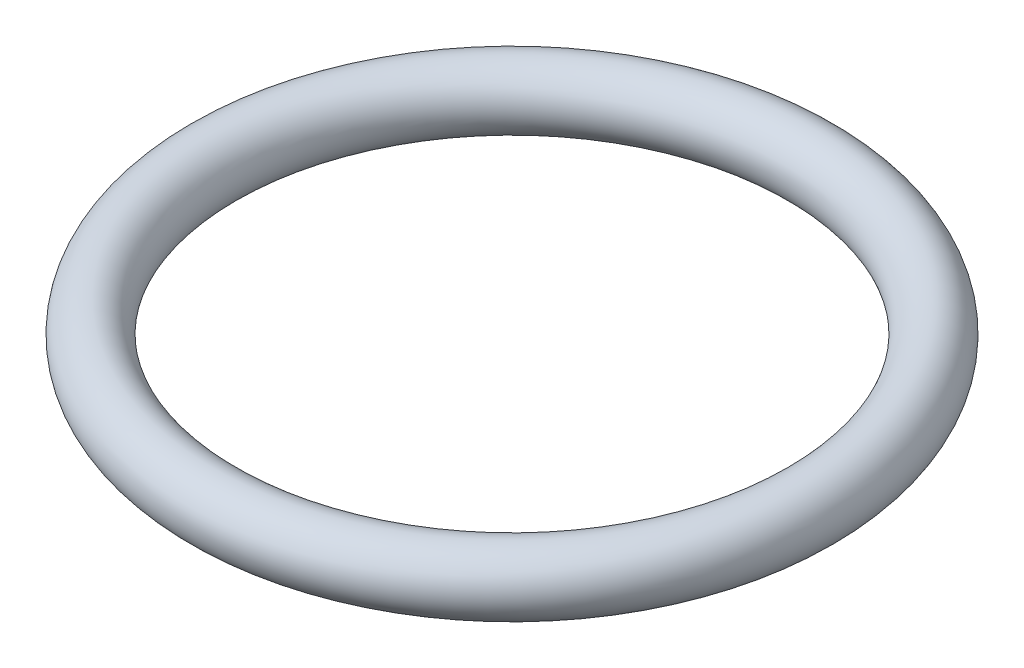
ISO-10303-21;
HEADER;
FILE_DESCRIPTION(('STEP AP214'),'2;1');
FILE_NAME('part.step','',(''),(''),'','','');
FILE_SCHEMA(('AUTOMOTIVE_DESIGN { 1 0 10303 214 1 1 1 1 }'));
ENDSEC;
DATA;
#1=APPLICATION_CONTEXT('core data for automotive mechanical design processes');
#2=APPLICATION_PROTOCOL_DEFINITION('international standard','automotive_design',2000,#1);
#3=PRODUCT_CONTEXT('',#1,'mechanical');
#4=PRODUCT('Part','Part','',(#3));
#5=PRODUCT_RELATED_PRODUCT_CATEGORY('part','',(#4));
#6=PRODUCT_DEFINITION_FORMATION('','',#4);
#7=PRODUCT_DEFINITION_CONTEXT('part definition',#1,'design');
#8=PRODUCT_DEFINITION('design','',#6,#7);
#9=PRODUCT_DEFINITION_SHAPE('','',#8);
#10=(LENGTH_UNIT() NAMED_UNIT(*) SI_UNIT(.MILLI.,.METRE.));
#11=(NAMED_UNIT(*) PLANE_ANGLE_UNIT() SI_UNIT($,.RADIAN.));
#12=(NAMED_UNIT(*) SI_UNIT($,.STERADIAN.) SOLID_ANGLE_UNIT());
#13=UNCERTAINTY_MEASURE_WITH_UNIT(LENGTH_MEASURE(1.E-05),#10,'distance_accuracy_value','');
#14=(GEOMETRIC_REPRESENTATION_CONTEXT(3) GLOBAL_UNCERTAINTY_ASSIGNED_CONTEXT((#13)) GLOBAL_UNIT_ASSIGNED_CONTEXT((#10,
#11,#12)) REPRESENTATION_CONTEXT('',''));
#15=CARTESIAN_POINT('',(0.,0.,0.));
#16=DIRECTION('',(0.,0.,1.));
#17=DIRECTION('',(1.,0.,0.));
#18=AXIS2_PLACEMENT_3D('',#15,#16,#17);
#19=CARTESIAN_POINT('',(8.8519,4.19437284389397,0.));
#20=DIRECTION('',(0.,-1.,0.));
#21=DIRECTION('',(1.,0.,0.));
#22=AXIS2_PLACEMENT_3D('',#19,#20,#21);
#23=TOROIDAL_SURFACE('',#22,11.2682728438939,1.190625);
#24=CARTESIAN_POINT('',(21.3107978438939,4.19437284389397,0.));
#25=VERTEX_POINT('',#24);
#26=VERTEX_LOOP('',#25);
#27=FACE_BOUND('',#26,.T.);
#28=ADVANCED_FACE('F33',(#27),#23,.T.);
#29=CLOSED_SHELL('',(#28));
#30=MANIFOLD_SOLID_BREP('B2',#29);
#31=ADVANCED_BREP_SHAPE_REPRESENTATION('',(#18,#30),#14);
#32=SHAPE_DEFINITION_REPRESENTATION(#9,#31);
ENDSEC;
END-ISO-10303-21;
